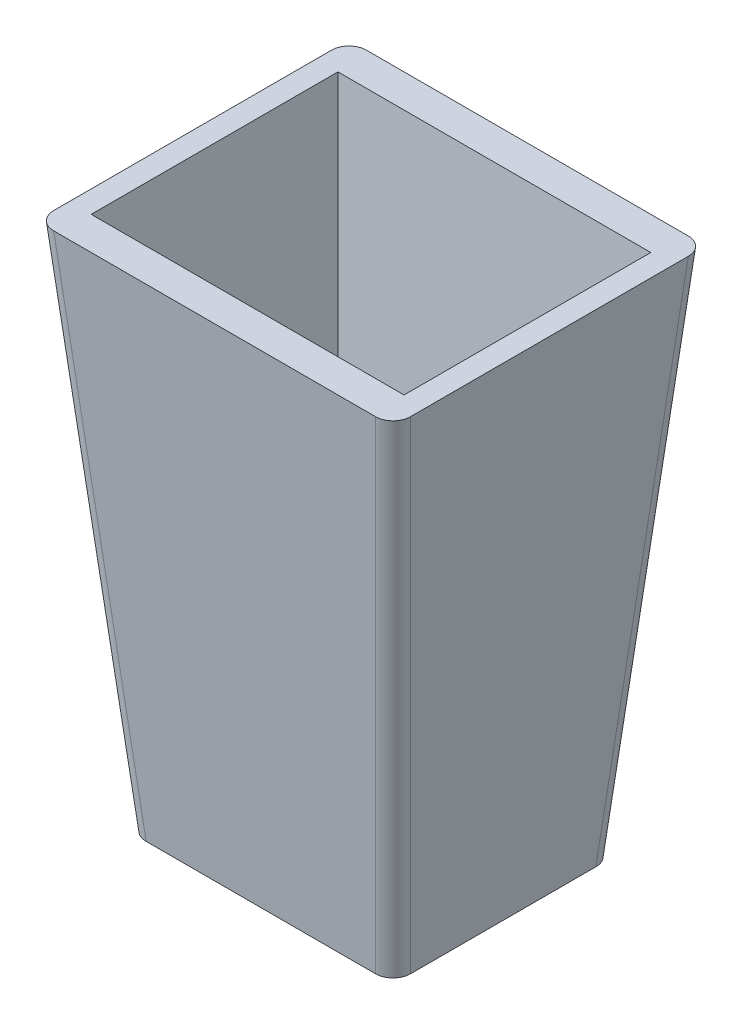
ISO-10303-21;
HEADER;
FILE_DESCRIPTION(('STEP AP214'),'2;1');
FILE_NAME('part.step','',(''),(''),'','','');
FILE_SCHEMA(('AUTOMOTIVE_DESIGN { 1 0 10303 214 1 1 1 1 }'));
ENDSEC;
DATA;
#1=APPLICATION_CONTEXT('core data for automotive mechanical design processes');
#2=APPLICATION_PROTOCOL_DEFINITION('international standard','automotive_design',2000,#1);
#3=PRODUCT_CONTEXT('',#1,'mechanical');
#4=PRODUCT('Part','Part','',(#3));
#5=PRODUCT_RELATED_PRODUCT_CATEGORY('part','',(#4));
#6=PRODUCT_DEFINITION_FORMATION('','',#4);
#7=PRODUCT_DEFINITION_CONTEXT('part definition',#1,'design');
#8=PRODUCT_DEFINITION('design','',#6,#7);
#9=PRODUCT_DEFINITION_SHAPE('','',#8);
#10=(LENGTH_UNIT() NAMED_UNIT(*) SI_UNIT(.MILLI.,.METRE.));
#11=(NAMED_UNIT(*) PLANE_ANGLE_UNIT() SI_UNIT($,.RADIAN.));
#12=(NAMED_UNIT(*) SI_UNIT($,.STERADIAN.) SOLID_ANGLE_UNIT());
#13=UNCERTAINTY_MEASURE_WITH_UNIT(LENGTH_MEASURE(1.E-05),#10,'distance_accuracy_value','');
#14=(GEOMETRIC_REPRESENTATION_CONTEXT(3) GLOBAL_UNCERTAINTY_ASSIGNED_CONTEXT((#13)) GLOBAL_UNIT_ASSIGNED_CONTEXT((#10,
#11,#12)) REPRESENTATION_CONTEXT('',''));
#15=CARTESIAN_POINT('',(0.,0.,0.));
#16=DIRECTION('',(0.,0.,1.));
#17=DIRECTION('',(1.,0.,0.));
#18=AXIS2_PLACEMENT_3D('',#15,#16,#17);
#19=CARTESIAN_POINT('',(19.05,0.,15.875));
#20=DIRECTION('',(0.996194698091746,-0.0871557427476582,0.));
#21=DIRECTION('',(0.0871557427476582,0.996194698091746,0.));
#22=AXIS2_PLACEMENT_3D('',#19,#20,#21);
#23=PLANE('',#22);
#24=DIRECTION('',(0.,0.,1.));
#25=VECTOR('',#24,1.);
#26=CARTESIAN_POINT('',(25.7166361606754,76.2,0.));
#27=LINE('',#26,#25);
#28=CARTESIAN_POINT('',(25.7166361606754,76.2,20.0113016275224));
#29=VERTEX_POINT('',#28);
#30=CARTESIAN_POINT('',(25.7166361606754,76.2,-20.0113016275224));
#31=VERTEX_POINT('',#30);
#32=EDGE_CURVE('E178',#29,#31,#27,.F.);
#33=ORIENTED_EDGE('',*,*,#32,.F.);
#34=DIRECTION('',(0.0868265938642477,0.992432509138967,0.0868265938642477));
#35=VECTOR('',#34,1.);
#36=CARTESIAN_POINT('',(19.069075831225,0.218037748620015,13.3637412980719));
#37=LINE('',#36,#35);
#38=CARTESIAN_POINT('',(19.05,0.,13.344665466847));
#39=VERTEX_POINT('',#38);
#40=EDGE_CURVE('E11',#29,#39,#37,.F.);
#41=ORIENTED_EDGE('',*,*,#40,.T.);
#42=DIRECTION('',(0.,0.,-1.));
#43=VECTOR('',#42,1.);
#44=CARTESIAN_POINT('',(19.05,0.,15.875));
#45=LINE('',#44,#43);
#46=CARTESIAN_POINT('',(19.05,0.,-13.344665466847));
#47=VERTEX_POINT('',#46);
#48=EDGE_CURVE('E157',#39,#47,#45,.T.);
#49=ORIENTED_EDGE('',*,*,#48,.T.);
#50=DIRECTION('',(0.0868265938642477,0.992432509138967,-0.0868265938642477));
#51=VECTOR('',#50,1.);
#52=CARTESIAN_POINT('',(18.8297171087093,-2.51784496885575,-13.1243825755563));
#53=LINE('',#52,#51);
#54=EDGE_CURVE('E41',#47,#31,#53,.T.);
#55=ORIENTED_EDGE('',*,*,#54,.T.);
#56=EDGE_LOOP('',(#33,#41,#49,#55));
#57=FACE_BOUND('',#56,.T.);
#58=ADVANCED_FACE('F33',(#57),#23,.T.);
#59=CARTESIAN_POINT('',(-19.05,0.,-15.875));
#60=DIRECTION('',(0.,-0.0871557427476582,-0.996194698091745));
#61=DIRECTION('',(0.,0.996194698091746,-0.0871557427476582));
#62=AXIS2_PLACEMENT_3D('',#59,#60,#61);
#63=PLANE('',#62);
#64=DIRECTION('',(-1.,0.,0.));
#65=VECTOR('',#64,1.);
#66=CARTESIAN_POINT('',(-19.05,0.,-15.875));
#67=LINE('',#66,#65);
#68=CARTESIAN_POINT('',(16.5196654668469,0.,-15.875));
#69=VERTEX_POINT('',#68);
#70=CARTESIAN_POINT('',(-16.519665466847,0.,-15.875));
#71=VERTEX_POINT('',#70);
#72=EDGE_CURVE('E170',#69,#71,#67,.T.);
#73=ORIENTED_EDGE('',*,*,#72,.T.);
#74=DIRECTION('',(-0.0868265938642477,0.992432509138967,-0.0868265938642477));
#75=VECTOR('',#74,1.);
#76=CARTESIAN_POINT('',(-16.5387412980719,0.218037748620015,-15.894075831225));
#77=LINE('',#76,#75);
#78=CARTESIAN_POINT('',(-23.1863016275224,76.2,-22.5416361606754));
#79=VERTEX_POINT('',#78);
#80=EDGE_CURVE('E204',#71,#79,#77,.T.);
#81=ORIENTED_EDGE('',*,*,#80,.T.);
#82=DIRECTION('',(1.,0.,0.));
#83=VECTOR('',#82,1.);
#84=CARTESIAN_POINT('',(0.,76.2,-22.5416361606754));
#85=LINE('',#84,#83);
#86=CARTESIAN_POINT('',(23.1863016275224,76.2,-22.5416361606754));
#87=VERTEX_POINT('',#86);
#88=EDGE_CURVE('E181',#87,#79,#85,.F.);
#89=ORIENTED_EDGE('',*,*,#88,.F.);
#90=DIRECTION('',(0.0868265938642477,0.992432509138967,-0.0868265938642477));
#91=VECTOR('',#90,1.);
#92=CARTESIAN_POINT('',(16.2515108310532,-3.0650215123509,-15.6068453642062));
#93=LINE('',#92,#91);
#94=EDGE_CURVE('E201',#87,#69,#93,.F.);
#95=ORIENTED_EDGE('',*,*,#94,.T.);
#96=EDGE_LOOP('',(#73,#81,#89,#95));
#97=FACE_BOUND('',#96,.T.);
#98=ADVANCED_FACE('F229',(#97),#63,.T.);
#99=CARTESIAN_POINT('',(-19.05,0.,15.875));
#100=DIRECTION('',(-0.996194698091746,-0.0871557427476582,0.));
#101=DIRECTION('',(0.0871557427476582,-0.996194698091746,0.));
#102=AXIS2_PLACEMENT_3D('',#99,#100,#101);
#103=PLANE('',#102);
#104=DIRECTION('',(0.,0.,-1.));
#105=VECTOR('',#104,1.);
#106=CARTESIAN_POINT('',(-25.7166361606754,76.2,0.));
#107=LINE('',#106,#105);
#108=CARTESIAN_POINT('',(-25.7166361606754,76.2,-20.0113016275224));
#109=VERTEX_POINT('',#108);
#110=CARTESIAN_POINT('',(-25.7166361606754,76.2,20.0113016275224));
#111=VERTEX_POINT('',#110);
#112=EDGE_CURVE('E184',#109,#111,#107,.F.);
#113=ORIENTED_EDGE('',*,*,#112,.F.);
#114=DIRECTION('',(-0.0868265938642477,0.992432509138967,-0.0868265938642477));
#115=VECTOR('',#114,1.);
#116=CARTESIAN_POINT('',(-18.8297171087093,-2.51784496885574,-13.1243825755563));
#117=LINE('',#116,#115);
#118=CARTESIAN_POINT('',(-19.05,0.,-13.344665466847));
#119=VERTEX_POINT('',#118);
#120=EDGE_CURVE('E190',#109,#119,#117,.F.);
#121=ORIENTED_EDGE('',*,*,#120,.T.);
#122=DIRECTION('',(0.,0.,1.));
#123=VECTOR('',#122,1.);
#124=CARTESIAN_POINT('',(-19.05,0.,15.875));
#125=LINE('',#124,#123);
#126=CARTESIAN_POINT('',(-19.05,0.,13.344665466847));
#127=VERTEX_POINT('',#126);
#128=EDGE_CURVE('E173',#119,#127,#125,.T.);
#129=ORIENTED_EDGE('',*,*,#128,.T.);
#130=DIRECTION('',(-0.0868265938642477,0.992432509138967,0.0868265938642477));
#131=VECTOR('',#130,1.);
#132=CARTESIAN_POINT('',(-19.069075831225,0.218037748620015,13.3637412980719));
#133=LINE('',#132,#131);
#134=EDGE_CURVE('E188',#127,#111,#133,.T.);
#135=ORIENTED_EDGE('',*,*,#134,.T.);
#136=EDGE_LOOP('',(#113,#121,#129,#135));
#137=FACE_BOUND('',#136,.T.);
#138=ADVANCED_FACE('F238',(#137),#103,.T.);
#139=CARTESIAN_POINT('',(-19.05,0.,15.875));
#140=DIRECTION('',(0.,-0.0871557427476582,0.996194698091745));
#141=DIRECTION('',(0.,-0.996194698091746,-0.0871557427476582));
#142=AXIS2_PLACEMENT_3D('',#139,#140,#141);
#143=PLANE('',#142);
#144=DIRECTION('',(-1.,0.,0.));
#145=VECTOR('',#144,1.);
#146=CARTESIAN_POINT('',(0.,76.2,22.5416361606754));
#147=LINE('',#146,#145);
#148=CARTESIAN_POINT('',(-23.1863016275224,76.2,22.5416361606754));
#149=VERTEX_POINT('',#148);
#150=CARTESIAN_POINT('',(23.1863016275224,76.2,22.5416361606754));
#151=VERTEX_POINT('',#150);
#152=EDGE_CURVE('E186',#149,#151,#147,.F.);
#153=ORIENTED_EDGE('',*,*,#152,.F.);
#154=DIRECTION('',(-0.0868265938642477,0.992432509138967,0.0868265938642477));
#155=VECTOR('',#154,1.);
#156=CARTESIAN_POINT('',(-16.5387412980719,0.218037748620015,15.894075831225));
#157=LINE('',#156,#155);
#158=CARTESIAN_POINT('',(-16.519665466847,0.,15.875));
#159=VERTEX_POINT('',#158);
#160=EDGE_CURVE('E214',#149,#159,#157,.F.);
#161=ORIENTED_EDGE('',*,*,#160,.T.);
#162=DIRECTION('',(1.,0.,0.));
#163=VECTOR('',#162,1.);
#164=CARTESIAN_POINT('',(-19.05,0.,15.875));
#165=LINE('',#164,#163);
#166=CARTESIAN_POINT('',(16.519665466847,0.,15.875));
#167=VERTEX_POINT('',#166);
#168=EDGE_CURVE('E176',#159,#167,#165,.T.);
#169=ORIENTED_EDGE('',*,*,#168,.T.);
#170=DIRECTION('',(0.0868265938642477,0.992432509138967,0.0868265938642477));
#171=VECTOR('',#170,1.);
#172=CARTESIAN_POINT('',(16.2515108310532,-3.0650215123509,15.6068453642062));
#173=LINE('',#172,#171);
#174=EDGE_CURVE('E48',#167,#151,#173,.T.);
#175=ORIENTED_EDGE('',*,*,#174,.T.);
#176=EDGE_LOOP('',(#153,#161,#169,#175));
#177=FACE_BOUND('',#176,.T.);
#178=ADVANCED_FACE('F244',(#177),#143,.T.);
#179=CARTESIAN_POINT('',(0.,76.2,0.));
#180=DIRECTION('',(0.,-1.,0.));
#181=DIRECTION('',(0.,0.,-1.));
#182=AXIS2_PLACEMENT_3D('',#179,#180,#181);
#183=PLANE('',#182);
#184=DIRECTION('',(1.,0.,0.));
#185=VECTOR('',#184,1.);
#186=CARTESIAN_POINT('',(-15.875,76.2,-17.7791361606754));
#187=LINE('',#186,#185);
#188=CARTESIAN_POINT('',(-22.5416361606754,76.2,-17.7791361606754));
#189=VERTEX_POINT('',#188);
#190=CARTESIAN_POINT('',(22.5416361606754,76.2,-17.7791361606754));
#191=VERTEX_POINT('',#190);
#192=EDGE_CURVE('E158',#189,#191,#187,.T.);
#193=ORIENTED_EDGE('',*,*,#192,.T.);
#194=DIRECTION('',(0.,0.,1.));
#195=VECTOR('',#194,1.);
#196=CARTESIAN_POINT('',(22.5416361606754,76.2,-11.1125));
#197=LINE('',#196,#195);
#198=CARTESIAN_POINT('',(22.5416361606754,76.2,17.7791361606754));
#199=VERTEX_POINT('',#198);
#200=EDGE_CURVE('E151',#191,#199,#197,.T.);
#201=ORIENTED_EDGE('',*,*,#200,.T.);
#202=DIRECTION('',(-1.,0.,0.));
#203=VECTOR('',#202,1.);
#204=CARTESIAN_POINT('',(-15.875,76.2,17.7791361606754));
#205=LINE('',#204,#203);
#206=CARTESIAN_POINT('',(-22.5416361606754,76.2,17.7791361606754));
#207=VERTEX_POINT('',#206);
#208=EDGE_CURVE('E163',#199,#207,#205,.T.);
#209=ORIENTED_EDGE('',*,*,#208,.T.);
#210=DIRECTION('',(0.,0.,-1.));
#211=VECTOR('',#210,1.);
#212=CARTESIAN_POINT('',(-22.5416361606754,76.2,-11.1125));
#213=LINE('',#212,#211);
#214=EDGE_CURVE('E131',#207,#189,#213,.T.);
#215=ORIENTED_EDGE('',*,*,#214,.T.);
#216=EDGE_LOOP('',(#193,#201,#209,#215));
#217=FACE_BOUND('',#216,.T.);
#218=ORIENTED_EDGE('',*,*,#88,.T.);
#219=CARTESIAN_POINT('',(-23.1669337733153,76.2,-19.9919337733153));
#220=DIRECTION('',(0.,-1.,0.));
#221=DIRECTION('',(0.707106781186548,0.,0.707106781186548));
#222=AXIS2_PLACEMENT_3D('',#219,#220,#221);
#223=ELLIPSE('',#222,2.55936799390389,2.54);
#224=EDGE_CURVE('E211',#79,#109,#223,.F.);
#225=ORIENTED_EDGE('',*,*,#224,.T.);
#226=ORIENTED_EDGE('',*,*,#112,.T.);
#227=CARTESIAN_POINT('',(-23.1669337733153,76.2,19.9919337733153));
#228=DIRECTION('',(0.,-1.,0.));
#229=DIRECTION('',(0.707106781186548,0.,-0.707106781186548));
#230=AXIS2_PLACEMENT_3D('',#227,#228,#229);
#231=ELLIPSE('',#230,2.55936799390389,2.54);
#232=EDGE_CURVE('E55',#111,#149,#231,.F.);
#233=ORIENTED_EDGE('',*,*,#232,.T.);
#234=ORIENTED_EDGE('',*,*,#152,.T.);
#235=CARTESIAN_POINT('',(23.1669337733153,76.2,19.9919337733153));
#236=DIRECTION('',(0.,-1.,0.));
#237=DIRECTION('',(-0.707106781186548,0.,-0.707106781186548));
#238=AXIS2_PLACEMENT_3D('',#235,#236,#237);
#239=ELLIPSE('',#238,2.55936799390389,2.54);
#240=EDGE_CURVE('E208',#151,#29,#239,.F.);
#241=ORIENTED_EDGE('',*,*,#240,.T.);
#242=ORIENTED_EDGE('',*,*,#32,.T.);
#243=CARTESIAN_POINT('',(23.1669337733153,76.2,-19.9919337733153));
#244=DIRECTION('',(0.,-1.,0.));
#245=DIRECTION('',(-0.707106781186548,0.,0.707106781186548));
#246=AXIS2_PLACEMENT_3D('',#243,#244,#245);
#247=ELLIPSE('',#246,2.55936799390389,2.54);
#248=EDGE_CURVE('E206',#31,#87,#247,.F.);
#249=ORIENTED_EDGE('',*,*,#248,.T.);
#250=EDGE_LOOP('',(#218,#225,#226,#233,#234,#241,#242,#249));
#251=FACE_BOUND('',#250,.T.);
#252=ADVANCED_FACE('F223',(#217,#251),#183,.F.);
#253=CARTESIAN_POINT('',(0.,0.,0.));
#254=DIRECTION('',(0.,-1.,0.));
#255=DIRECTION('',(0.,0.,-1.));
#256=AXIS2_PLACEMENT_3D('',#253,#254,#255);
#257=PLANE('',#256);
#258=DIRECTION('',(0.,0.,1.));
#259=VECTOR('',#258,1.);
#260=CARTESIAN_POINT('',(15.875,0.,-11.1125));
#261=LINE('',#260,#259);
#262=CARTESIAN_POINT('',(15.875,0.,-11.1125));
#263=VERTEX_POINT('',#262);
#264=CARTESIAN_POINT('',(15.875,0.,11.1125));
#265=VERTEX_POINT('',#264);
#266=EDGE_CURVE('E144',#263,#265,#261,.T.);
#267=ORIENTED_EDGE('',*,*,#266,.F.);
#268=DIRECTION('',(1.,0.,0.));
#269=VECTOR('',#268,1.);
#270=CARTESIAN_POINT('',(-15.875,0.,-11.1125));
#271=LINE('',#270,#269);
#272=CARTESIAN_POINT('',(-15.875,0.,-11.1125));
#273=VERTEX_POINT('',#272);
#274=EDGE_CURVE('E149',#273,#263,#271,.T.);
#275=ORIENTED_EDGE('',*,*,#274,.F.);
#276=DIRECTION('',(0.,0.,-1.));
#277=VECTOR('',#276,1.);
#278=CARTESIAN_POINT('',(-15.875,0.,-11.1125));
#279=LINE('',#278,#277);
#280=CARTESIAN_POINT('',(-15.875,0.,11.1125));
#281=VERTEX_POINT('',#280);
#282=EDGE_CURVE('E128',#281,#273,#279,.T.);
#283=ORIENTED_EDGE('',*,*,#282,.F.);
#284=DIRECTION('',(-1.,0.,0.));
#285=VECTOR('',#284,1.);
#286=CARTESIAN_POINT('',(-15.875,0.,11.1125));
#287=LINE('',#286,#285);
#288=EDGE_CURVE('E140',#265,#281,#287,.T.);
#289=ORIENTED_EDGE('',*,*,#288,.F.);
#290=EDGE_LOOP('',(#267,#275,#283,#289));
#291=FACE_BOUND('',#290,.T.);
#292=ORIENTED_EDGE('',*,*,#128,.F.);
#293=CARTESIAN_POINT('',(-16.5002976126399,0.,-13.3252976126399));
#294=DIRECTION('',(0.,-1.,0.));
#295=DIRECTION('',(0.707106781186548,0.,0.707106781186548));
#296=AXIS2_PLACEMENT_3D('',#293,#294,#295);
#297=ELLIPSE('',#296,2.55936799390389,2.54);
#298=EDGE_CURVE('E199',#119,#71,#297,.T.);
#299=ORIENTED_EDGE('',*,*,#298,.T.);
#300=ORIENTED_EDGE('',*,*,#72,.F.);
#301=CARTESIAN_POINT('',(16.5002976126399,0.,-13.3252976126399));
#302=DIRECTION('',(0.,-1.,0.));
#303=DIRECTION('',(-0.707106781186548,0.,0.707106781186548));
#304=AXIS2_PLACEMENT_3D('',#301,#302,#303);
#305=ELLIPSE('',#304,2.55936799390389,2.54);
#306=EDGE_CURVE('E193',#69,#47,#305,.T.);
#307=ORIENTED_EDGE('',*,*,#306,.T.);
#308=ORIENTED_EDGE('',*,*,#48,.F.);
#309=CARTESIAN_POINT('',(16.5002976126399,0.,13.3252976126399));
#310=DIRECTION('',(0.,-1.,0.));
#311=DIRECTION('',(-0.707106781186548,0.,-0.707106781186548));
#312=AXIS2_PLACEMENT_3D('',#309,#310,#311);
#313=ELLIPSE('',#312,2.55936799390389,2.54);
#314=EDGE_CURVE('E195',#39,#167,#313,.T.);
#315=ORIENTED_EDGE('',*,*,#314,.T.);
#316=ORIENTED_EDGE('',*,*,#168,.F.);
#317=CARTESIAN_POINT('',(-16.5002976126399,0.,13.3252976126399));
#318=DIRECTION('',(0.,-1.,0.));
#319=DIRECTION('',(0.707106781186548,0.,-0.707106781186548));
#320=AXIS2_PLACEMENT_3D('',#317,#318,#319);
#321=ELLIPSE('',#320,2.55936799390389,2.54);
#322=EDGE_CURVE('E197',#159,#127,#321,.T.);
#323=ORIENTED_EDGE('',*,*,#322,.T.);
#324=EDGE_LOOP('',(#292,#299,#300,#307,#308,#315,#316,#323));
#325=FACE_BOUND('',#324,.T.);
#326=ADVANCED_FACE('F146',(#291,#325),#257,.T.);
#327=CARTESIAN_POINT('',(15.875,0.,-11.1125));
#328=DIRECTION('',(0.996194698091746,-0.0871557427476582,0.));
#329=DIRECTION('',(0.0871557427476582,0.996194698091746,0.));
#330=AXIS2_PLACEMENT_3D('',#327,#328,#329);
#331=PLANE('',#330);
#332=ORIENTED_EDGE('',*,*,#266,.T.);
#333=DIRECTION('',(-0.0868265938642476,-0.992432509138967,-0.0868265938642476));
#334=VECTOR('',#333,1.);
#335=CARTESIAN_POINT('',(15.7074488942391,-1.91511790223303,10.9449488942391));
#336=LINE('',#335,#334);
#337=EDGE_CURVE('E136',#199,#265,#336,.T.);
#338=ORIENTED_EDGE('',*,*,#337,.F.);
#339=ORIENTED_EDGE('',*,*,#200,.F.);
#340=DIRECTION('',(-0.0868265938642476,-0.992432509138967,0.0868265938642476));
#341=VECTOR('',#340,1.);
#342=CARTESIAN_POINT('',(15.6356412774844,-2.73588271747576,-10.8731412774844));
#343=LINE('',#342,#341);
#344=EDGE_CURVE('E155',#191,#263,#343,.T.);
#345=ORIENTED_EDGE('',*,*,#344,.T.);
#346=EDGE_LOOP('',(#332,#338,#339,#345));
#347=FACE_BOUND('',#346,.T.);
#348=ADVANCED_FACE('F277',(#347),#331,.F.);
#349=CARTESIAN_POINT('',(-15.875,0.,-11.1125));
#350=DIRECTION('',(0.,-0.0871557427476582,-0.996194698091746));
#351=DIRECTION('',(0.,0.996194698091746,-0.0871557427476582));
#352=AXIS2_PLACEMENT_3D('',#349,#350,#351);
#353=PLANE('',#352);
#354=ORIENTED_EDGE('',*,*,#274,.T.);
#355=ORIENTED_EDGE('',*,*,#344,.F.);
#356=ORIENTED_EDGE('',*,*,#192,.F.);
#357=DIRECTION('',(0.0868265938642476,-0.992432509138967,0.0868265938642476));
#358=VECTOR('',#357,1.);
#359=CARTESIAN_POINT('',(-15.875,0.,-11.1125));
#360=LINE('',#359,#358);
#361=EDGE_CURVE('E135',#189,#273,#360,.T.);
#362=ORIENTED_EDGE('',*,*,#361,.T.);
#363=EDGE_LOOP('',(#354,#355,#356,#362));
#364=FACE_BOUND('',#363,.T.);
#365=ADVANCED_FACE('F274',(#364),#353,.F.);
#366=CARTESIAN_POINT('',(-15.875,0.,-11.1125));
#367=DIRECTION('',(-0.996194698091746,-0.0871557427476582,0.));
#368=DIRECTION('',(0.0871557427476582,-0.996194698091746,0.));
#369=AXIS2_PLACEMENT_3D('',#366,#367,#368);
#370=PLANE('',#369);
#371=ORIENTED_EDGE('',*,*,#282,.T.);
#372=ORIENTED_EDGE('',*,*,#361,.F.);
#373=ORIENTED_EDGE('',*,*,#214,.F.);
#374=DIRECTION('',(0.0868265938642476,-0.992432509138967,-0.0868265938642476));
#375=VECTOR('',#374,1.);
#376=CARTESIAN_POINT('',(-15.875,0.,11.1125));
#377=LINE('',#376,#375);
#378=EDGE_CURVE('E124',#207,#281,#377,.T.);
#379=ORIENTED_EDGE('',*,*,#378,.T.);
#380=EDGE_LOOP('',(#371,#372,#373,#379));
#381=FACE_BOUND('',#380,.T.);
#382=ADVANCED_FACE('F126',(#381),#370,.F.);
#383=CARTESIAN_POINT('',(-15.875,0.,11.1125));
#384=DIRECTION('',(0.,-0.0871557427476582,0.996194698091746));
#385=DIRECTION('',(0.,-0.996194698091746,-0.0871557427476582));
#386=AXIS2_PLACEMENT_3D('',#383,#384,#385);
#387=PLANE('',#386);
#388=ORIENTED_EDGE('',*,*,#288,.T.);
#389=ORIENTED_EDGE('',*,*,#378,.F.);
#390=ORIENTED_EDGE('',*,*,#208,.F.);
#391=ORIENTED_EDGE('',*,*,#337,.T.);
#392=EDGE_LOOP('',(#388,#389,#390,#391));
#393=FACE_BOUND('',#392,.T.);
#394=ADVANCED_FACE('F141',(#393),#387,.F.);
#395=CARTESIAN_POINT('',(-16.2993825755563,-2.29646938227669,-13.1243825755563));
#396=DIRECTION('',(0.0868265938642477,-0.992432509138967,0.0868265938642477));
#397=DIRECTION('',(0.,-0.0871557427476582,-0.996194698091746));
#398=AXIS2_PLACEMENT_3D('',#395,#396,#397);
#399=CYLINDRICAL_SURFACE('',#398,2.54);
#400=ORIENTED_EDGE('',*,*,#224,.F.);
#401=ORIENTED_EDGE('',*,*,#80,.F.);
#402=ORIENTED_EDGE('',*,*,#298,.F.);
#403=ORIENTED_EDGE('',*,*,#120,.F.);
#404=EDGE_LOOP('',(#400,#401,#402,#403));
#405=FACE_BOUND('',#404,.T.);
#406=ADVANCED_FACE('F235',(#405),#399,.T.);
#407=CARTESIAN_POINT('',(-16.5387412980719,0.439413335199067,13.3637412980719));
#408=DIRECTION('',(0.0868265938642477,-0.992432509138967,-0.0868265938642477));
#409=DIRECTION('',(0.,0.0871557427476582,-0.996194698091746));
#410=AXIS2_PLACEMENT_3D('',#407,#408,#409);
#411=CYLINDRICAL_SURFACE('',#410,2.54);
#412=ORIENTED_EDGE('',*,*,#232,.F.);
#413=ORIENTED_EDGE('',*,*,#134,.F.);
#414=ORIENTED_EDGE('',*,*,#322,.F.);
#415=ORIENTED_EDGE('',*,*,#160,.F.);
#416=EDGE_LOOP('',(#412,#413,#414,#415));
#417=FACE_BOUND('',#416,.T.);
#418=ADVANCED_FACE('F242',(#417),#411,.T.);
#419=CARTESIAN_POINT('',(16.5387412980719,0.439413335199067,13.3637412980719));
#420=DIRECTION('',(-0.0868265938642477,-0.992432509138967,-0.0868265938642477));
#421=DIRECTION('',(0.,0.0871557427476582,-0.996194698091746));
#422=AXIS2_PLACEMENT_3D('',#419,#420,#421);
#423=CYLINDRICAL_SURFACE('',#422,2.54);
#424=ORIENTED_EDGE('',*,*,#240,.F.);
#425=ORIENTED_EDGE('',*,*,#174,.F.);
#426=ORIENTED_EDGE('',*,*,#314,.F.);
#427=ORIENTED_EDGE('',*,*,#40,.F.);
#428=EDGE_LOOP('',(#424,#425,#426,#427));
#429=FACE_BOUND('',#428,.T.);
#430=ADVANCED_FACE('F246',(#429),#423,.T.);
#431=CARTESIAN_POINT('',(16.2515108310532,-2.84364592577184,-13.0765108310532));
#432=DIRECTION('',(-0.0868265938642477,-0.992432509138967,0.0868265938642477));
#433=DIRECTION('',(0.,-0.0871557427476582,-0.996194698091746));
#434=AXIS2_PLACEMENT_3D('',#431,#432,#433);
#435=CYLINDRICAL_SURFACE('',#434,2.54);
#436=ORIENTED_EDGE('',*,*,#248,.F.);
#437=ORIENTED_EDGE('',*,*,#54,.F.);
#438=ORIENTED_EDGE('',*,*,#306,.F.);
#439=ORIENTED_EDGE('',*,*,#94,.F.);
#440=EDGE_LOOP('',(#436,#437,#438,#439));
#441=FACE_BOUND('',#440,.T.);
#442=ADVANCED_FACE('F35',(#441),#435,.T.);
#443=CLOSED_SHELL('',(#58,#98,#138,#178,#252,#326,#348,#365,#382,#394,#406,#418,#430,#442));
#444=MANIFOLD_SOLID_BREP('B2',#443);
#445=ADVANCED_BREP_SHAPE_REPRESENTATION('',(#18,#444),#14);
#446=SHAPE_DEFINITION_REPRESENTATION(#9,#445);
ENDSEC;
END-ISO-10303-21;
